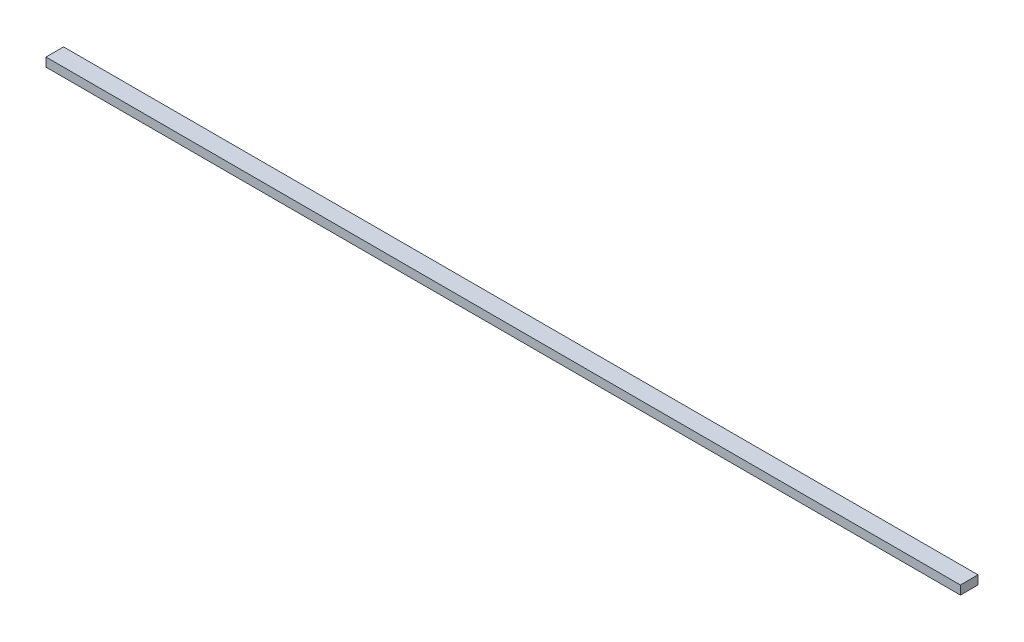
ISO-10303-21;
HEADER;
FILE_DESCRIPTION(('STEP AP214'),'2;1');
FILE_NAME('part.step','',(''),(''),'','','');
FILE_SCHEMA(('AUTOMOTIVE_DESIGN { 1 0 10303 214 1 1 1 1 }'));
ENDSEC;
DATA;
#1=APPLICATION_CONTEXT('core data for automotive mechanical design processes');
#2=APPLICATION_PROTOCOL_DEFINITION('international standard','automotive_design',2000,#1);
#3=PRODUCT_CONTEXT('',#1,'mechanical');
#4=PRODUCT('Part','Part','',(#3));
#5=PRODUCT_RELATED_PRODUCT_CATEGORY('part','',(#4));
#6=PRODUCT_DEFINITION_FORMATION('','',#4);
#7=PRODUCT_DEFINITION_CONTEXT('part definition',#1,'design');
#8=PRODUCT_DEFINITION('design','',#6,#7);
#9=PRODUCT_DEFINITION_SHAPE('','',#8);
#10=(LENGTH_UNIT() NAMED_UNIT(*) SI_UNIT(.MILLI.,.METRE.));
#11=(NAMED_UNIT(*) PLANE_ANGLE_UNIT() SI_UNIT($,.RADIAN.));
#12=(NAMED_UNIT(*) SI_UNIT($,.STERADIAN.) SOLID_ANGLE_UNIT());
#13=UNCERTAINTY_MEASURE_WITH_UNIT(LENGTH_MEASURE(1.E-05),#10,'distance_accuracy_value','');
#14=(GEOMETRIC_REPRESENTATION_CONTEXT(3) GLOBAL_UNCERTAINTY_ASSIGNED_CONTEXT((#13)) GLOBAL_UNIT_ASSIGNED_CONTEXT((#10,
#11,#12)) REPRESENTATION_CONTEXT('',''));
#15=CARTESIAN_POINT('',(0.,0.,0.));
#16=DIRECTION('',(0.,0.,1.));
#17=DIRECTION('',(1.,0.,0.));
#18=AXIS2_PLACEMENT_3D('',#15,#16,#17);
#19=CARTESIAN_POINT('',(-407.499582985822,18.,-218.58215179316));
#20=DIRECTION('',(1.,0.,0.));
#21=DIRECTION('',(0.,0.,-1.));
#22=AXIS2_PLACEMENT_3D('',#19,#20,#21);
#23=PLANE('',#22);
#24=DIRECTION('',(0.,0.,1.));
#25=VECTOR('',#24,1.);
#26=CARTESIAN_POINT('',(-407.499582985822,0.,-218.58215179316));
#27=LINE('',#26,#25);
#28=CARTESIAN_POINT('',(-407.499582985822,0.,-218.58215179316));
#29=VERTEX_POINT('',#28);
#30=CARTESIAN_POINT('',(-407.499582985822,0.,-182.58215179316));
#31=VERTEX_POINT('',#30);
#32=EDGE_CURVE('E98',#29,#31,#27,.T.);
#33=ORIENTED_EDGE('',*,*,#32,.T.);
#34=DIRECTION('',(0.,-1.,0.));
#35=VECTOR('',#34,1.);
#36=CARTESIAN_POINT('',(-407.499582985822,18.,-182.58215179316));
#37=LINE('',#36,#35);
#38=CARTESIAN_POINT('',(-407.499582985822,18.,-182.58215179316));
#39=VERTEX_POINT('',#38);
#40=EDGE_CURVE('E11',#39,#31,#37,.T.);
#41=ORIENTED_EDGE('',*,*,#40,.F.);
#42=DIRECTION('',(0.,0.,1.));
#43=VECTOR('',#42,1.);
#44=CARTESIAN_POINT('',(-407.499582985822,18.,-218.58215179316));
#45=LINE('',#44,#43);
#46=CARTESIAN_POINT('',(-407.499582985822,18.,-218.58215179316));
#47=VERTEX_POINT('',#46);
#48=EDGE_CURVE('E86',#47,#39,#45,.T.);
#49=ORIENTED_EDGE('',*,*,#48,.F.);
#50=DIRECTION('',(0.,-1.,0.));
#51=VECTOR('',#50,1.);
#52=CARTESIAN_POINT('',(-407.499582985822,18.,-218.58215179316));
#53=LINE('',#52,#51);
#54=EDGE_CURVE('E94',#47,#29,#53,.T.);
#55=ORIENTED_EDGE('',*,*,#54,.T.);
#56=EDGE_LOOP('',(#33,#41,#49,#55));
#57=FACE_BOUND('',#56,.T.);
#58=ADVANCED_FACE('F35',(#57),#23,.F.);
#59=CARTESIAN_POINT('',(-407.499582985822,18.,-182.58215179316));
#60=DIRECTION('',(0.,0.,-1.));
#61=DIRECTION('',(-1.,0.,0.));
#62=AXIS2_PLACEMENT_3D('',#59,#60,#61);
#63=PLANE('',#62);
#64=DIRECTION('',(1.,0.,0.));
#65=VECTOR('',#64,1.);
#66=CARTESIAN_POINT('',(-407.499582985822,0.,-182.58215179316));
#67=LINE('',#66,#65);
#68=CARTESIAN_POINT('',(1464.50041701418,0.,-182.58215179316));
#69=VERTEX_POINT('',#68);
#70=EDGE_CURVE('E90',#31,#69,#67,.T.);
#71=ORIENTED_EDGE('',*,*,#70,.T.);
#72=DIRECTION('',(0.,-1.,0.));
#73=VECTOR('',#72,1.);
#74=CARTESIAN_POINT('',(1464.50041701418,18.,-182.58215179316));
#75=LINE('',#74,#73);
#76=CARTESIAN_POINT('',(1464.50041701418,18.,-182.58215179316));
#77=VERTEX_POINT('',#76);
#78=EDGE_CURVE('E43',#77,#69,#75,.T.);
#79=ORIENTED_EDGE('',*,*,#78,.F.);
#80=DIRECTION('',(1.,0.,0.));
#81=VECTOR('',#80,1.);
#82=CARTESIAN_POINT('',(-407.499582985822,18.,-182.58215179316));
#83=LINE('',#82,#81);
#84=EDGE_CURVE('E81',#39,#77,#83,.T.);
#85=ORIENTED_EDGE('',*,*,#84,.F.);
#86=ORIENTED_EDGE('',*,*,#40,.T.);
#87=EDGE_LOOP('',(#71,#79,#85,#86));
#88=FACE_BOUND('',#87,.T.);
#89=ADVANCED_FACE('F89',(#88),#63,.F.);
#90=CARTESIAN_POINT('',(1464.50041701418,18.,-218.58215179316));
#91=DIRECTION('',(-1.,0.,0.));
#92=DIRECTION('',(0.,0.,1.));
#93=AXIS2_PLACEMENT_3D('',#90,#91,#92);
#94=PLANE('',#93);
#95=DIRECTION('',(0.,0.,-1.));
#96=VECTOR('',#95,1.);
#97=CARTESIAN_POINT('',(1464.50041701418,0.,-218.58215179316));
#98=LINE('',#97,#96);
#99=CARTESIAN_POINT('',(1464.50041701418,0.,-218.58215179316));
#100=VERTEX_POINT('',#99);
#101=EDGE_CURVE('E68',#69,#100,#98,.T.);
#102=ORIENTED_EDGE('',*,*,#101,.T.);
#103=DIRECTION('',(0.,-1.,0.));
#104=VECTOR('',#103,1.);
#105=CARTESIAN_POINT('',(1464.50041701418,18.,-218.58215179316));
#106=LINE('',#105,#104);
#107=CARTESIAN_POINT('',(1464.50041701418,18.,-218.58215179316));
#108=VERTEX_POINT('',#107);
#109=EDGE_CURVE('E91',#108,#100,#106,.T.);
#110=ORIENTED_EDGE('',*,*,#109,.F.);
#111=DIRECTION('',(0.,0.,-1.));
#112=VECTOR('',#111,1.);
#113=CARTESIAN_POINT('',(1464.50041701418,18.,-218.58215179316));
#114=LINE('',#113,#112);
#115=EDGE_CURVE('E84',#77,#108,#114,.T.);
#116=ORIENTED_EDGE('',*,*,#115,.F.);
#117=ORIENTED_EDGE('',*,*,#78,.T.);
#118=EDGE_LOOP('',(#102,#110,#116,#117));
#119=FACE_BOUND('',#118,.T.);
#120=ADVANCED_FACE('F92',(#119),#94,.F.);
#121=CARTESIAN_POINT('',(-407.499582985822,18.,-218.58215179316));
#122=DIRECTION('',(0.,0.,1.));
#123=DIRECTION('',(1.,0.,0.));
#124=AXIS2_PLACEMENT_3D('',#121,#122,#123);
#125=PLANE('',#124);
#126=DIRECTION('',(-1.,0.,0.));
#127=VECTOR('',#126,1.);
#128=CARTESIAN_POINT('',(-407.499582985822,0.,-218.58215179316));
#129=LINE('',#128,#127);
#130=EDGE_CURVE('E74',#100,#29,#129,.T.);
#131=ORIENTED_EDGE('',*,*,#130,.T.);
#132=ORIENTED_EDGE('',*,*,#54,.F.);
#133=DIRECTION('',(-1.,0.,0.));
#134=VECTOR('',#133,1.);
#135=CARTESIAN_POINT('',(-407.499582985822,18.,-218.58215179316));
#136=LINE('',#135,#134);
#137=EDGE_CURVE('E51',#108,#47,#136,.T.);
#138=ORIENTED_EDGE('',*,*,#137,.F.);
#139=ORIENTED_EDGE('',*,*,#109,.T.);
#140=EDGE_LOOP('',(#131,#132,#138,#139));
#141=FACE_BOUND('',#140,.T.);
#142=ADVANCED_FACE('F105',(#141),#125,.F.);
#143=CARTESIAN_POINT('',(0.,18.,0.));
#144=DIRECTION('',(0.,1.,0.));
#145=DIRECTION('',(0.,0.,1.));
#146=AXIS2_PLACEMENT_3D('',#143,#144,#145);
#147=PLANE('',#146);
#148=ORIENTED_EDGE('',*,*,#48,.T.);
#149=ORIENTED_EDGE('',*,*,#84,.T.);
#150=ORIENTED_EDGE('',*,*,#115,.T.);
#151=ORIENTED_EDGE('',*,*,#137,.T.);
#152=EDGE_LOOP('',(#148,#149,#150,#151));
#153=FACE_BOUND('',#152,.T.);
#154=ADVANCED_FACE('F82',(#153),#147,.T.);
#155=CARTESIAN_POINT('',(0.,0.,0.));
#156=DIRECTION('',(0.,1.,0.));
#157=DIRECTION('',(0.,0.,1.));
#158=AXIS2_PLACEMENT_3D('',#155,#156,#157);
#159=PLANE('',#158);
#160=ORIENTED_EDGE('',*,*,#32,.F.);
#161=ORIENTED_EDGE('',*,*,#130,.F.);
#162=ORIENTED_EDGE('',*,*,#101,.F.);
#163=ORIENTED_EDGE('',*,*,#70,.F.);
#164=EDGE_LOOP('',(#160,#161,#162,#163));
#165=FACE_BOUND('',#164,.T.);
#166=ADVANCED_FACE('F108',(#165),#159,.F.);
#167=CLOSED_SHELL('',(#58,#89,#120,#142,#154,#166));
#168=MANIFOLD_SOLID_BREP('B2',#167);
#169=ADVANCED_BREP_SHAPE_REPRESENTATION('',(#18,#168),#14);
#170=SHAPE_DEFINITION_REPRESENTATION(#9,#169);
ENDSEC;
END-ISO-10303-21;
